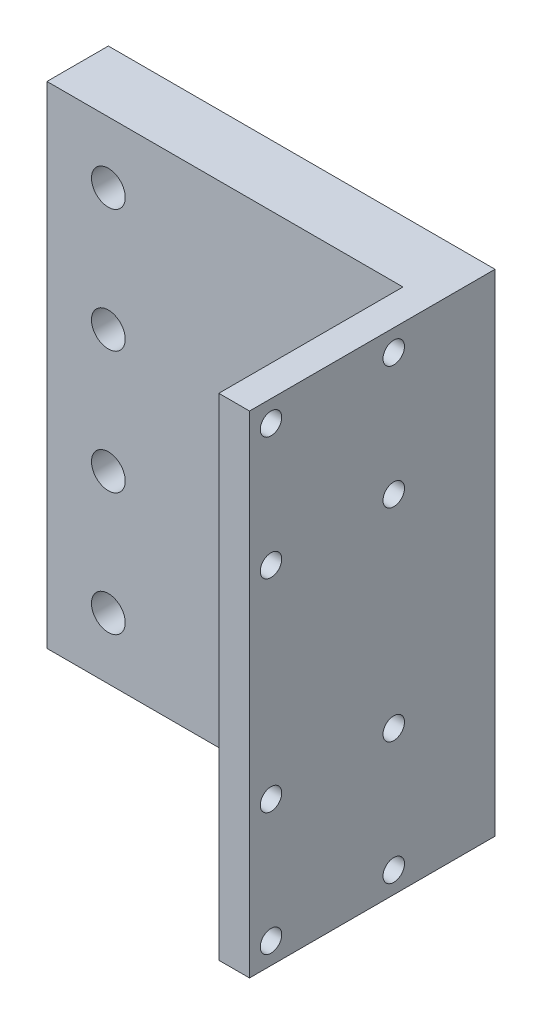
ISO-10303-21;
HEADER;
FILE_DESCRIPTION(('STEP AP214'),'2;1');
FILE_NAME('part.step','',(''),(''),'','','');
FILE_SCHEMA(('AUTOMOTIVE_DESIGN { 1 0 10303 214 1 1 1 1 }'));
ENDSEC;
DATA;
#1=APPLICATION_CONTEXT('core data for automotive mechanical design processes');
#2=APPLICATION_PROTOCOL_DEFINITION('international standard','automotive_design',2000,#1);
#3=PRODUCT_CONTEXT('',#1,'mechanical');
#4=PRODUCT('Part','Part','',(#3));
#5=PRODUCT_RELATED_PRODUCT_CATEGORY('part','',(#4));
#6=PRODUCT_DEFINITION_FORMATION('','',#4);
#7=PRODUCT_DEFINITION_CONTEXT('part definition',#1,'design');
#8=PRODUCT_DEFINITION('design','',#6,#7);
#9=PRODUCT_DEFINITION_SHAPE('','',#8);
#10=(LENGTH_UNIT() NAMED_UNIT(*) SI_UNIT(.MILLI.,.METRE.));
#11=(NAMED_UNIT(*) PLANE_ANGLE_UNIT() SI_UNIT($,.RADIAN.));
#12=(NAMED_UNIT(*) SI_UNIT($,.STERADIAN.) SOLID_ANGLE_UNIT());
#13=UNCERTAINTY_MEASURE_WITH_UNIT(LENGTH_MEASURE(1.E-05),#10,'distance_accuracy_value','');
#14=(GEOMETRIC_REPRESENTATION_CONTEXT(3) GLOBAL_UNCERTAINTY_ASSIGNED_CONTEXT((#13)) GLOBAL_UNIT_ASSIGNED_CONTEXT((#10,
#11,#12)) REPRESENTATION_CONTEXT('',''));
#15=CARTESIAN_POINT('',(0.,0.,0.));
#16=DIRECTION('',(0.,0.,1.));
#17=DIRECTION('',(1.,0.,0.));
#18=AXIS2_PLACEMENT_3D('',#15,#16,#17);
#19=CARTESIAN_POINT('',(-23.3968723584108,14.3516483516484,10.));
#20=DIRECTION('',(0.,0.,-1.));
#21=DIRECTION('',(-1.,0.,0.));
#22=AXIS2_PLACEMENT_3D('',#19,#20,#21);
#23=CYLINDRICAL_SURFACE('',#22,2.75);
#24=CARTESIAN_POINT('',(-23.3968723584108,14.3516483516484,10.));
#25=DIRECTION('',(0.,0.,1.));
#26=DIRECTION('',(1.,0.,0.));
#27=AXIS2_PLACEMENT_3D('',#24,#25,#26);
#28=CIRCLE('',#27,2.75);
#29=CARTESIAN_POINT('',(-20.6468723584108,14.3516483516484,10.));
#30=VERTEX_POINT('',#29);
#31=EDGE_CURVE('E111',#30,#30,#28,.T.);
#32=ORIENTED_EDGE('',*,*,#31,.T.);
#33=EDGE_LOOP('',(#32));
#34=FACE_BOUND('',#33,.T.);
#35=CARTESIAN_POINT('',(-23.3968723584108,14.3516483516484,5.));
#36=DIRECTION('',(0.,0.,-1.));
#37=DIRECTION('',(-1.,0.,0.));
#38=AXIS2_PLACEMENT_3D('',#35,#36,#37);
#39=CIRCLE('',#38,2.75);
#40=CARTESIAN_POINT('',(-26.1468723584108,14.3516483516484,5.));
#41=VERTEX_POINT('',#40);
#42=EDGE_CURVE('E45',#41,#41,#39,.T.);
#43=ORIENTED_EDGE('',*,*,#42,.T.);
#44=EDGE_LOOP('',(#43));
#45=FACE_BOUND('',#44,.T.);
#46=ADVANCED_FACE('F41',(#34,#45),#23,.F.);
#47=CARTESIAN_POINT('',(-23.3968723584108,-5.64835164835165,10.));
#48=DIRECTION('',(0.,0.,-1.));
#49=DIRECTION('',(-1.,0.,0.));
#50=AXIS2_PLACEMENT_3D('',#47,#48,#49);
#51=CYLINDRICAL_SURFACE('',#50,2.75);
#52=CARTESIAN_POINT('',(-23.3968723584108,-5.64835164835165,10.));
#53=DIRECTION('',(0.,0.,1.));
#54=DIRECTION('',(1.,0.,0.));
#55=AXIS2_PLACEMENT_3D('',#52,#53,#54);
#56=CIRCLE('',#55,2.75);
#57=CARTESIAN_POINT('',(-20.6468723584108,-5.64835164835165,10.));
#58=VERTEX_POINT('',#57);
#59=EDGE_CURVE('E117',#58,#58,#56,.T.);
#60=ORIENTED_EDGE('',*,*,#59,.T.);
#61=EDGE_LOOP('',(#60));
#62=FACE_BOUND('',#61,.T.);
#63=CARTESIAN_POINT('',(-23.3968723584108,-5.64835164835165,5.));
#64=DIRECTION('',(0.,0.,-1.));
#65=DIRECTION('',(-1.,0.,0.));
#66=AXIS2_PLACEMENT_3D('',#63,#64,#65);
#67=CIRCLE('',#66,2.75);
#68=CARTESIAN_POINT('',(-26.1468723584108,-5.64835164835165,5.));
#69=VERTEX_POINT('',#68);
#70=EDGE_CURVE('E137',#69,#69,#67,.T.);
#71=ORIENTED_EDGE('',*,*,#70,.T.);
#72=EDGE_LOOP('',(#71));
#73=FACE_BOUND('',#72,.T.);
#74=ADVANCED_FACE('F266',(#62,#73),#51,.F.);
#75=CARTESIAN_POINT('',(-23.3968723584108,-25.6483516483516,10.));
#76=DIRECTION('',(0.,0.,-1.));
#77=DIRECTION('',(-1.,0.,0.));
#78=AXIS2_PLACEMENT_3D('',#75,#76,#77);
#79=CYLINDRICAL_SURFACE('',#78,2.75);
#80=CARTESIAN_POINT('',(-23.3968723584108,-25.6483516483516,10.));
#81=DIRECTION('',(0.,0.,1.));
#82=DIRECTION('',(1.,0.,0.));
#83=AXIS2_PLACEMENT_3D('',#80,#81,#82);
#84=CIRCLE('',#83,2.75);
#85=CARTESIAN_POINT('',(-20.6468723584108,-25.6483516483516,10.));
#86=VERTEX_POINT('',#85);
#87=EDGE_CURVE('E227',#86,#86,#84,.T.);
#88=ORIENTED_EDGE('',*,*,#87,.T.);
#89=EDGE_LOOP('',(#88));
#90=FACE_BOUND('',#89,.T.);
#91=CARTESIAN_POINT('',(-23.3968723584108,-25.6483516483516,5.));
#92=DIRECTION('',(0.,0.,-1.));
#93=DIRECTION('',(-1.,0.,0.));
#94=AXIS2_PLACEMENT_3D('',#91,#92,#93);
#95=CIRCLE('',#94,2.75);
#96=CARTESIAN_POINT('',(-26.1468723584108,-25.6483516483516,5.));
#97=VERTEX_POINT('',#96);
#98=EDGE_CURVE('E133',#97,#97,#95,.T.);
#99=ORIENTED_EDGE('',*,*,#98,.T.);
#100=EDGE_LOOP('',(#99));
#101=FACE_BOUND('',#100,.T.);
#102=ADVANCED_FACE('F272',(#90,#101),#79,.F.);
#103=CARTESIAN_POINT('',(-23.3968723584108,-45.6483516483516,10.));
#104=DIRECTION('',(0.,0.,-1.));
#105=DIRECTION('',(-1.,0.,0.));
#106=AXIS2_PLACEMENT_3D('',#103,#104,#105);
#107=CYLINDRICAL_SURFACE('',#106,2.75);
#108=CARTESIAN_POINT('',(-23.3968723584108,-45.6483516483516,10.));
#109=DIRECTION('',(0.,0.,1.));
#110=DIRECTION('',(1.,0.,0.));
#111=AXIS2_PLACEMENT_3D('',#108,#109,#110);
#112=CIRCLE('',#111,2.75);
#113=CARTESIAN_POINT('',(-20.6468723584108,-45.6483516483516,10.));
#114=VERTEX_POINT('',#113);
#115=EDGE_CURVE('E220',#114,#114,#112,.T.);
#116=ORIENTED_EDGE('',*,*,#115,.T.);
#117=EDGE_LOOP('',(#116));
#118=FACE_BOUND('',#117,.T.);
#119=CARTESIAN_POINT('',(-23.3968723584108,-45.6483516483516,5.));
#120=DIRECTION('',(0.,0.,-1.));
#121=DIRECTION('',(-1.,0.,0.));
#122=AXIS2_PLACEMENT_3D('',#119,#120,#121);
#123=CIRCLE('',#122,2.75);
#124=CARTESIAN_POINT('',(-26.1468723584108,-45.6483516483516,5.));
#125=VERTEX_POINT('',#124);
#126=EDGE_CURVE('E129',#125,#125,#123,.T.);
#127=ORIENTED_EDGE('',*,*,#126,.T.);
#128=EDGE_LOOP('',(#127));
#129=FACE_BOUND('',#128,.T.);
#130=ADVANCED_FACE('F279',(#118,#129),#107,.F.);
#131=CARTESIAN_POINT('',(0.,0.,10.));
#132=DIRECTION('',(0.,0.,1.));
#133=DIRECTION('',(1.,0.,0.));
#134=AXIS2_PLACEMENT_3D('',#131,#132,#133);
#135=PLANE('',#134);
#136=ORIENTED_EDGE('',*,*,#87,.F.);
#137=EDGE_LOOP('',(#136));
#138=FACE_BOUND('',#137,.T.);
#139=ORIENTED_EDGE('',*,*,#31,.F.);
#140=EDGE_LOOP('',(#139));
#141=FACE_BOUND('',#140,.T.);
#142=ORIENTED_EDGE('',*,*,#59,.F.);
#143=EDGE_LOOP('',(#142));
#144=FACE_BOUND('',#143,.T.);
#145=ORIENTED_EDGE('',*,*,#115,.F.);
#146=EDGE_LOOP('',(#145));
#147=FACE_BOUND('',#146,.T.);
#148=DIRECTION('',(1.,0.,0.));
#149=VECTOR('',#148,1.);
#150=CARTESIAN_POINT('',(-33.3968723584108,-55.6483516483516,10.));
#151=LINE('',#150,#149);
#152=CARTESIAN_POINT('',(-33.3968723584108,-55.6483516483516,10.));
#153=VERTEX_POINT('',#152);
#154=CARTESIAN_POINT('',(24.6031276415892,-55.6483516483516,10.));
#155=VERTEX_POINT('',#154);
#156=EDGE_CURVE('E235',#153,#155,#151,.T.);
#157=ORIENTED_EDGE('',*,*,#156,.T.);
#158=DIRECTION('',(0.,1.,0.));
#159=VECTOR('',#158,1.);
#160=CARTESIAN_POINT('',(24.6031276415892,-55.6483516483516,10.));
#161=LINE('',#160,#159);
#162=CARTESIAN_POINT('',(24.6031276415892,24.3516483516484,10.));
#163=VERTEX_POINT('',#162);
#164=EDGE_CURVE('E197',#155,#163,#161,.T.);
#165=ORIENTED_EDGE('',*,*,#164,.T.);
#166=DIRECTION('',(-1.,0.,0.));
#167=VECTOR('',#166,1.);
#168=CARTESIAN_POINT('',(-33.3968723584108,24.3516483516484,10.));
#169=LINE('',#168,#167);
#170=CARTESIAN_POINT('',(-33.3968723584108,24.3516483516484,10.));
#171=VERTEX_POINT('',#170);
#172=EDGE_CURVE('E67',#163,#171,#169,.T.);
#173=ORIENTED_EDGE('',*,*,#172,.T.);
#174=DIRECTION('',(0.,-1.,0.));
#175=VECTOR('',#174,1.);
#176=CARTESIAN_POINT('',(-33.3968723584108,24.3516483516484,10.));
#177=LINE('',#176,#175);
#178=EDGE_CURVE('E99',#171,#153,#177,.T.);
#179=ORIENTED_EDGE('',*,*,#178,.T.);
#180=EDGE_LOOP('',(#157,#165,#173,#179));
#181=FACE_BOUND('',#180,.T.);
#182=ADVANCED_FACE('F240',(#138,#141,#144,#147,#181),#135,.T.);
#183=CARTESIAN_POINT('',(0.,0.,0.));
#184=DIRECTION('',(0.,0.,1.));
#185=DIRECTION('',(1.,0.,0.));
#186=AXIS2_PLACEMENT_3D('',#183,#184,#185);
#187=PLANE('',#186);
#188=CARTESIAN_POINT('',(-23.3968723584108,-45.6483516483516,0.));
#189=DIRECTION('',(0.,0.,-1.));
#190=DIRECTION('',(-1.,0.,0.));
#191=AXIS2_PLACEMENT_3D('',#188,#189,#190);
#192=CIRCLE('',#191,6.);
#193=CARTESIAN_POINT('',(-29.3968723584108,-45.6483516483516,0.));
#194=VERTEX_POINT('',#193);
#195=EDGE_CURVE('E487',#194,#194,#192,.T.);
#196=ORIENTED_EDGE('',*,*,#195,.F.);
#197=EDGE_LOOP('',(#196));
#198=FACE_BOUND('',#197,.T.);
#199=CARTESIAN_POINT('',(-23.3968723584108,-25.6483516483516,0.));
#200=DIRECTION('',(0.,0.,-1.));
#201=DIRECTION('',(-1.,0.,0.));
#202=AXIS2_PLACEMENT_3D('',#199,#200,#201);
#203=CIRCLE('',#202,6.);
#204=CARTESIAN_POINT('',(-29.3968723584108,-25.6483516483516,0.));
#205=VERTEX_POINT('',#204);
#206=EDGE_CURVE('E497',#205,#205,#203,.T.);
#207=ORIENTED_EDGE('',*,*,#206,.F.);
#208=EDGE_LOOP('',(#207));
#209=FACE_BOUND('',#208,.T.);
#210=CARTESIAN_POINT('',(-23.3968723584108,-5.64835164835165,0.));
#211=DIRECTION('',(0.,0.,-1.));
#212=DIRECTION('',(-1.,0.,0.));
#213=AXIS2_PLACEMENT_3D('',#210,#211,#212);
#214=CIRCLE('',#213,6.);
#215=CARTESIAN_POINT('',(-29.3968723584108,-5.64835164835165,0.));
#216=VERTEX_POINT('',#215);
#217=EDGE_CURVE('E505',#216,#216,#214,.T.);
#218=ORIENTED_EDGE('',*,*,#217,.F.);
#219=EDGE_LOOP('',(#218));
#220=FACE_BOUND('',#219,.T.);
#221=CARTESIAN_POINT('',(-23.3968723584108,14.3516483516484,0.));
#222=DIRECTION('',(0.,0.,-1.));
#223=DIRECTION('',(-1.,0.,0.));
#224=AXIS2_PLACEMENT_3D('',#221,#222,#223);
#225=CIRCLE('',#224,6.);
#226=CARTESIAN_POINT('',(-29.3968723584108,14.3516483516484,0.));
#227=VERTEX_POINT('',#226);
#228=EDGE_CURVE('E513',#227,#227,#225,.T.);
#229=ORIENTED_EDGE('',*,*,#228,.F.);
#230=EDGE_LOOP('',(#229));
#231=FACE_BOUND('',#230,.T.);
#232=DIRECTION('',(0.,-1.,0.));
#233=VECTOR('',#232,1.);
#234=CARTESIAN_POINT('',(-33.3968723584108,24.3516483516484,0.));
#235=LINE('',#234,#233);
#236=CARTESIAN_POINT('',(-33.3968723584108,24.3516483516484,0.));
#237=VERTEX_POINT('',#236);
#238=CARTESIAN_POINT('',(-33.3968723584108,-55.6483516483516,0.));
#239=VERTEX_POINT('',#238);
#240=EDGE_CURVE('E105',#237,#239,#235,.T.);
#241=ORIENTED_EDGE('',*,*,#240,.F.);
#242=DIRECTION('',(-1.,0.,0.));
#243=VECTOR('',#242,1.);
#244=CARTESIAN_POINT('',(-33.3968723584108,24.3516483516484,0.));
#245=LINE('',#244,#243);
#246=CARTESIAN_POINT('',(29.6031276415892,24.3516483516484,0.));
#247=VERTEX_POINT('',#246);
#248=EDGE_CURVE('E87',#247,#237,#245,.T.);
#249=ORIENTED_EDGE('',*,*,#248,.F.);
#250=DIRECTION('',(0.,1.,0.));
#251=VECTOR('',#250,1.);
#252=CARTESIAN_POINT('',(29.6031276415892,24.3516483516484,0.));
#253=LINE('',#252,#251);
#254=CARTESIAN_POINT('',(29.6031276415892,-55.6483516483516,0.));
#255=VERTEX_POINT('',#254);
#256=EDGE_CURVE('E100',#255,#247,#253,.T.);
#257=ORIENTED_EDGE('',*,*,#256,.F.);
#258=DIRECTION('',(1.,0.,0.));
#259=VECTOR('',#258,1.);
#260=CARTESIAN_POINT('',(-33.3968723584108,-55.6483516483516,0.));
#261=LINE('',#260,#259);
#262=EDGE_CURVE('E109',#239,#255,#261,.T.);
#263=ORIENTED_EDGE('',*,*,#262,.F.);
#264=EDGE_LOOP('',(#241,#249,#257,#263));
#265=FACE_BOUND('',#264,.T.);
#266=ADVANCED_FACE('F108',(#198,#209,#220,#231,#265),#187,.F.);
#267=CARTESIAN_POINT('',(-33.3968723584108,24.3516483516484,10.));
#268=DIRECTION('',(1.,0.,0.));
#269=DIRECTION('',(0.,0.,-1.));
#270=AXIS2_PLACEMENT_3D('',#267,#268,#269);
#271=PLANE('',#270);
#272=ORIENTED_EDGE('',*,*,#240,.T.);
#273=DIRECTION('',(0.,0.,-1.));
#274=VECTOR('',#273,1.);
#275=CARTESIAN_POINT('',(-33.3968723584108,-55.6483516483516,10.));
#276=LINE('',#275,#274);
#277=EDGE_CURVE('E11',#153,#239,#276,.T.);
#278=ORIENTED_EDGE('',*,*,#277,.F.);
#279=ORIENTED_EDGE('',*,*,#178,.F.);
#280=DIRECTION('',(0.,0.,-1.));
#281=VECTOR('',#280,1.);
#282=CARTESIAN_POINT('',(-33.3968723584108,24.3516483516484,10.));
#283=LINE('',#282,#281);
#284=EDGE_CURVE('E90',#171,#237,#283,.T.);
#285=ORIENTED_EDGE('',*,*,#284,.T.);
#286=EDGE_LOOP('',(#272,#278,#279,#285));
#287=FACE_BOUND('',#286,.T.);
#288=ADVANCED_FACE('F43',(#287),#271,.F.);
#289=CARTESIAN_POINT('',(-33.3968723584108,-55.6483516483516,10.));
#290=DIRECTION('',(0.,1.,0.));
#291=DIRECTION('',(0.,0.,1.));
#292=AXIS2_PLACEMENT_3D('',#289,#290,#291);
#293=PLANE('',#292);
#294=ORIENTED_EDGE('',*,*,#262,.T.);
#295=DIRECTION('',(0.,0.,-1.));
#296=VECTOR('',#295,1.);
#297=CARTESIAN_POINT('',(29.6031276415892,-55.6483516483516,10.));
#298=LINE('',#297,#296);
#299=CARTESIAN_POINT('',(29.6031276415892,-55.6483516483516,40.));
#300=VERTEX_POINT('',#299);
#301=EDGE_CURVE('E51',#300,#255,#298,.T.);
#302=ORIENTED_EDGE('',*,*,#301,.F.);
#303=DIRECTION('',(-1.,0.,0.));
#304=VECTOR('',#303,1.);
#305=CARTESIAN_POINT('',(29.6031276415892,-55.6483516483516,40.));
#306=LINE('',#305,#304);
#307=CARTESIAN_POINT('',(24.6031276415892,-55.6483516483516,40.));
#308=VERTEX_POINT('',#307);
#309=EDGE_CURVE('E205',#300,#308,#306,.T.);
#310=ORIENTED_EDGE('',*,*,#309,.T.);
#311=DIRECTION('',(0.,0.,-1.));
#312=VECTOR('',#311,1.);
#313=CARTESIAN_POINT('',(24.6031276415892,-55.6483516483516,40.));
#314=LINE('',#313,#312);
#315=EDGE_CURVE('E215',#308,#155,#314,.T.);
#316=ORIENTED_EDGE('',*,*,#315,.T.);
#317=ORIENTED_EDGE('',*,*,#156,.F.);
#318=ORIENTED_EDGE('',*,*,#277,.T.);
#319=EDGE_LOOP('',(#294,#302,#310,#316,#317,#318));
#320=FACE_BOUND('',#319,.T.);
#321=ADVANCED_FACE('F243',(#320),#293,.F.);
#322=CARTESIAN_POINT('',(29.6031276415892,24.3516483516484,10.));
#323=DIRECTION('',(-1.,0.,0.));
#324=DIRECTION('',(0.,-1.,0.));
#325=AXIS2_PLACEMENT_3D('',#322,#323,#324);
#326=PLANE('',#325);
#327=CARTESIAN_POINT('',(29.6031276415892,0.851648351648357,36.5));
#328=DIRECTION('',(1.,0.,0.));
#329=DIRECTION('',(0.,1.,0.));
#330=AXIS2_PLACEMENT_3D('',#327,#328,#329);
#331=CIRCLE('',#330,1.75);
#332=CARTESIAN_POINT('',(29.6031276415892,2.60164835164836,36.5));
#333=VERTEX_POINT('',#332);
#334=EDGE_CURVE('E168',#333,#333,#331,.T.);
#335=ORIENTED_EDGE('',*,*,#334,.F.);
#336=EDGE_LOOP('',(#335));
#337=FACE_BOUND('',#336,.T.);
#338=CARTESIAN_POINT('',(29.6031276415892,-52.1483516483516,16.5));
#339=DIRECTION('',(1.,0.,0.));
#340=DIRECTION('',(0.,1.,0.));
#341=AXIS2_PLACEMENT_3D('',#338,#339,#340);
#342=CIRCLE('',#341,1.75);
#343=CARTESIAN_POINT('',(29.6031276415892,-50.3983516483516,16.5));
#344=VERTEX_POINT('',#343);
#345=EDGE_CURVE('E159',#344,#344,#342,.T.);
#346=ORIENTED_EDGE('',*,*,#345,.F.);
#347=EDGE_LOOP('',(#346));
#348=FACE_BOUND('',#347,.T.);
#349=CARTESIAN_POINT('',(29.6031276415892,-32.1483516483516,16.5));
#350=DIRECTION('',(1.,0.,0.));
#351=DIRECTION('',(0.,1.,0.));
#352=AXIS2_PLACEMENT_3D('',#349,#350,#351);
#353=CIRCLE('',#352,1.75);
#354=CARTESIAN_POINT('',(29.6031276415892,-30.3983516483516,16.5));
#355=VERTEX_POINT('',#354);
#356=EDGE_CURVE('E186',#355,#355,#353,.T.);
#357=ORIENTED_EDGE('',*,*,#356,.F.);
#358=EDGE_LOOP('',(#357));
#359=FACE_BOUND('',#358,.T.);
#360=CARTESIAN_POINT('',(29.6031276415892,-32.1483516483516,36.5));
#361=DIRECTION('',(1.,0.,0.));
#362=DIRECTION('',(0.,1.,0.));
#363=AXIS2_PLACEMENT_3D('',#360,#361,#362);
#364=CIRCLE('',#363,1.75);
#365=CARTESIAN_POINT('',(29.6031276415892,-30.3983516483516,36.5));
#366=VERTEX_POINT('',#365);
#367=EDGE_CURVE('E177',#366,#366,#364,.T.);
#368=ORIENTED_EDGE('',*,*,#367,.F.);
#369=EDGE_LOOP('',(#368));
#370=FACE_BOUND('',#369,.T.);
#371=CARTESIAN_POINT('',(29.6031276415892,20.8516483516484,36.5));
#372=DIRECTION('',(1.,0.,0.));
#373=DIRECTION('',(0.,1.,0.));
#374=AXIS2_PLACEMENT_3D('',#371,#372,#373);
#375=CIRCLE('',#374,1.75);
#376=CARTESIAN_POINT('',(29.6031276415892,22.6016483516484,36.5));
#377=VERTEX_POINT('',#376);
#378=EDGE_CURVE('E176',#377,#377,#375,.T.);
#379=ORIENTED_EDGE('',*,*,#378,.F.);
#380=EDGE_LOOP('',(#379));
#381=FACE_BOUND('',#380,.T.);
#382=CARTESIAN_POINT('',(29.6031276415892,20.8516483516484,16.5));
#383=DIRECTION('',(1.,0.,0.));
#384=DIRECTION('',(0.,1.,0.));
#385=AXIS2_PLACEMENT_3D('',#382,#383,#384);
#386=CIRCLE('',#385,1.75);
#387=CARTESIAN_POINT('',(29.6031276415892,22.6016483516484,16.5));
#388=VERTEX_POINT('',#387);
#389=EDGE_CURVE('E524',#388,#388,#386,.T.);
#390=ORIENTED_EDGE('',*,*,#389,.F.);
#391=EDGE_LOOP('',(#390));
#392=FACE_BOUND('',#391,.T.);
#393=CARTESIAN_POINT('',(29.6031276415892,0.851648351648357,16.5));
#394=DIRECTION('',(1.,0.,0.));
#395=DIRECTION('',(0.,1.,0.));
#396=AXIS2_PLACEMENT_3D('',#393,#394,#395);
#397=CIRCLE('',#396,1.75);
#398=CARTESIAN_POINT('',(29.6031276415892,2.60164835164836,16.5));
#399=VERTEX_POINT('',#398);
#400=EDGE_CURVE('E149',#399,#399,#397,.T.);
#401=ORIENTED_EDGE('',*,*,#400,.F.);
#402=EDGE_LOOP('',(#401));
#403=FACE_BOUND('',#402,.T.);
#404=CARTESIAN_POINT('',(29.6031276415892,-52.1483516483516,36.5));
#405=DIRECTION('',(1.,0.,0.));
#406=DIRECTION('',(0.,1.,0.));
#407=AXIS2_PLACEMENT_3D('',#404,#405,#406);
#408=CIRCLE('',#407,1.75);
#409=CARTESIAN_POINT('',(29.6031276415892,-50.3983516483516,36.5));
#410=VERTEX_POINT('',#409);
#411=EDGE_CURVE('E193',#410,#410,#408,.T.);
#412=ORIENTED_EDGE('',*,*,#411,.F.);
#413=EDGE_LOOP('',(#412));
#414=FACE_BOUND('',#413,.T.);
#415=ORIENTED_EDGE('',*,*,#256,.T.);
#416=DIRECTION('',(0.,0.,-1.));
#417=VECTOR('',#416,1.);
#418=CARTESIAN_POINT('',(29.6031276415892,24.3516483516484,10.));
#419=LINE('',#418,#417);
#420=CARTESIAN_POINT('',(29.6031276415892,24.3516483516484,40.));
#421=VERTEX_POINT('',#420);
#422=EDGE_CURVE('E94',#421,#247,#419,.T.);
#423=ORIENTED_EDGE('',*,*,#422,.F.);
#424=DIRECTION('',(0.,-1.,0.));
#425=VECTOR('',#424,1.);
#426=CARTESIAN_POINT('',(29.6031276415892,-55.6483516483516,40.));
#427=LINE('',#426,#425);
#428=EDGE_CURVE('E201',#421,#300,#427,.T.);
#429=ORIENTED_EDGE('',*,*,#428,.T.);
#430=ORIENTED_EDGE('',*,*,#301,.T.);
#431=EDGE_LOOP('',(#415,#423,#429,#430));
#432=FACE_BOUND('',#431,.T.);
#433=ADVANCED_FACE('F261',(#337,#348,#359,#370,#381,#392,#403,#414,#432),#326,.F.);
#434=CARTESIAN_POINT('',(-33.3968723584108,24.3516483516484,10.));
#435=DIRECTION('',(0.,-1.,0.));
#436=DIRECTION('',(0.,0.,-1.));
#437=AXIS2_PLACEMENT_3D('',#434,#435,#436);
#438=PLANE('',#437);
#439=ORIENTED_EDGE('',*,*,#248,.T.);
#440=ORIENTED_EDGE('',*,*,#284,.F.);
#441=ORIENTED_EDGE('',*,*,#172,.F.);
#442=DIRECTION('',(0.,0.,-1.));
#443=VECTOR('',#442,1.);
#444=CARTESIAN_POINT('',(24.6031276415892,24.3516483516484,40.));
#445=LINE('',#444,#443);
#446=CARTESIAN_POINT('',(24.6031276415892,24.3516483516484,40.));
#447=VERTEX_POINT('',#446);
#448=EDGE_CURVE('E59',#447,#163,#445,.T.);
#449=ORIENTED_EDGE('',*,*,#448,.F.);
#450=DIRECTION('',(1.,0.,0.));
#451=VECTOR('',#450,1.);
#452=CARTESIAN_POINT('',(29.6031276415892,24.3516483516484,40.));
#453=LINE('',#452,#451);
#454=EDGE_CURVE('E212',#447,#421,#453,.T.);
#455=ORIENTED_EDGE('',*,*,#454,.T.);
#456=ORIENTED_EDGE('',*,*,#422,.T.);
#457=EDGE_LOOP('',(#439,#440,#441,#449,#455,#456));
#458=FACE_BOUND('',#457,.T.);
#459=ADVANCED_FACE('F89',(#458),#438,.F.);
#460=CARTESIAN_POINT('',(24.6031276415892,-55.6483516483516,40.));
#461=DIRECTION('',(-1.,0.,0.));
#462=DIRECTION('',(0.,0.,1.));
#463=AXIS2_PLACEMENT_3D('',#460,#461,#462);
#464=PLANE('',#463);
#465=CARTESIAN_POINT('',(24.6031276415892,0.851648351648356,36.5));
#466=DIRECTION('',(-1.,0.,0.));
#467=DIRECTION('',(0.,0.,1.));
#468=AXIS2_PLACEMENT_3D('',#465,#466,#467);
#469=CIRCLE('',#468,1.75);
#470=CARTESIAN_POINT('',(24.6031276415892,0.851648351648356,38.25));
#471=VERTEX_POINT('',#470);
#472=EDGE_CURVE('E172',#471,#471,#469,.F.);
#473=ORIENTED_EDGE('',*,*,#472,.T.);
#474=EDGE_LOOP('',(#473));
#475=FACE_BOUND('',#474,.T.);
#476=CARTESIAN_POINT('',(24.6031276415892,-52.1483516483516,16.5));
#477=DIRECTION('',(-1.,0.,0.));
#478=DIRECTION('',(0.,0.,1.));
#479=AXIS2_PLACEMENT_3D('',#476,#477,#478);
#480=CIRCLE('',#479,1.75);
#481=CARTESIAN_POINT('',(24.6031276415892,-52.1483516483516,18.25));
#482=VERTEX_POINT('',#481);
#483=EDGE_CURVE('E164',#482,#482,#480,.F.);
#484=ORIENTED_EDGE('',*,*,#483,.T.);
#485=EDGE_LOOP('',(#484));
#486=FACE_BOUND('',#485,.T.);
#487=CARTESIAN_POINT('',(24.6031276415892,-32.1483516483516,16.5));
#488=DIRECTION('',(-1.,0.,0.));
#489=DIRECTION('',(0.,0.,1.));
#490=AXIS2_PLACEMENT_3D('',#487,#488,#489);
#491=CIRCLE('',#490,1.75);
#492=CARTESIAN_POINT('',(24.6031276415892,-32.1483516483516,18.25));
#493=VERTEX_POINT('',#492);
#494=EDGE_CURVE('E163',#493,#493,#491,.F.);
#495=ORIENTED_EDGE('',*,*,#494,.T.);
#496=EDGE_LOOP('',(#495));
#497=FACE_BOUND('',#496,.T.);
#498=CARTESIAN_POINT('',(24.6031276415892,-32.1483516483516,36.5));
#499=DIRECTION('',(-1.,0.,0.));
#500=DIRECTION('',(0.,0.,1.));
#501=AXIS2_PLACEMENT_3D('',#498,#499,#500);
#502=CIRCLE('',#501,1.75);
#503=CARTESIAN_POINT('',(24.6031276415892,-32.1483516483516,38.25));
#504=VERTEX_POINT('',#503);
#505=EDGE_CURVE('E182',#504,#504,#502,.F.);
#506=ORIENTED_EDGE('',*,*,#505,.T.);
#507=EDGE_LOOP('',(#506));
#508=FACE_BOUND('',#507,.T.);
#509=CARTESIAN_POINT('',(24.6031276415892,20.8516483516484,36.5));
#510=DIRECTION('',(-1.,0.,0.));
#511=DIRECTION('',(0.,0.,1.));
#512=AXIS2_PLACEMENT_3D('',#509,#510,#511);
#513=CIRCLE('',#512,1.75);
#514=CARTESIAN_POINT('',(24.6031276415892,20.8516483516484,38.25));
#515=VERTEX_POINT('',#514);
#516=EDGE_CURVE('E520',#515,#515,#513,.F.);
#517=ORIENTED_EDGE('',*,*,#516,.T.);
#518=EDGE_LOOP('',(#517));
#519=FACE_BOUND('',#518,.T.);
#520=CARTESIAN_POINT('',(24.6031276415892,20.8516483516484,16.5));
#521=DIRECTION('',(-1.,0.,0.));
#522=DIRECTION('',(0.,0.,1.));
#523=AXIS2_PLACEMENT_3D('',#520,#521,#522);
#524=CIRCLE('',#523,1.75);
#525=CARTESIAN_POINT('',(24.6031276415892,20.8516483516484,18.25));
#526=VERTEX_POINT('',#525);
#527=EDGE_CURVE('E155',#526,#526,#524,.F.);
#528=ORIENTED_EDGE('',*,*,#527,.T.);
#529=EDGE_LOOP('',(#528));
#530=FACE_BOUND('',#529,.T.);
#531=CARTESIAN_POINT('',(24.6031276415892,0.851648351648356,16.5));
#532=DIRECTION('',(-1.,0.,0.));
#533=DIRECTION('',(0.,0.,1.));
#534=AXIS2_PLACEMENT_3D('',#531,#532,#533);
#535=CIRCLE('',#534,1.75);
#536=CARTESIAN_POINT('',(24.6031276415892,0.851648351648356,18.25));
#537=VERTEX_POINT('',#536);
#538=EDGE_CURVE('E144',#537,#537,#535,.F.);
#539=ORIENTED_EDGE('',*,*,#538,.T.);
#540=EDGE_LOOP('',(#539));
#541=FACE_BOUND('',#540,.T.);
#542=CARTESIAN_POINT('',(24.6031276415892,-52.1483516483516,36.5));
#543=DIRECTION('',(-1.,0.,0.));
#544=DIRECTION('',(0.,0.,1.));
#545=AXIS2_PLACEMENT_3D('',#542,#543,#544);
#546=CIRCLE('',#545,1.75);
#547=CARTESIAN_POINT('',(24.6031276415892,-52.1483516483516,38.25));
#548=VERTEX_POINT('',#547);
#549=EDGE_CURVE('E181',#548,#548,#546,.F.);
#550=ORIENTED_EDGE('',*,*,#549,.T.);
#551=EDGE_LOOP('',(#550));
#552=FACE_BOUND('',#551,.T.);
#553=ORIENTED_EDGE('',*,*,#164,.F.);
#554=ORIENTED_EDGE('',*,*,#315,.F.);
#555=DIRECTION('',(0.,1.,0.));
#556=VECTOR('',#555,1.);
#557=CARTESIAN_POINT('',(24.6031276415892,-55.6483516483516,40.));
#558=LINE('',#557,#556);
#559=EDGE_CURVE('E209',#308,#447,#558,.T.);
#560=ORIENTED_EDGE('',*,*,#559,.T.);
#561=ORIENTED_EDGE('',*,*,#448,.T.);
#562=EDGE_LOOP('',(#553,#554,#560,#561));
#563=FACE_BOUND('',#562,.T.);
#564=ADVANCED_FACE('F249',(#475,#486,#497,#508,#519,#530,#541,#552,#563),#464,.T.);
#565=CARTESIAN_POINT('',(0.,0.,40.));
#566=DIRECTION('',(0.,0.,1.));
#567=DIRECTION('',(1.,0.,0.));
#568=AXIS2_PLACEMENT_3D('',#565,#566,#567);
#569=PLANE('',#568);
#570=ORIENTED_EDGE('',*,*,#428,.F.);
#571=ORIENTED_EDGE('',*,*,#454,.F.);
#572=ORIENTED_EDGE('',*,*,#559,.F.);
#573=ORIENTED_EDGE('',*,*,#309,.F.);
#574=EDGE_LOOP('',(#570,#571,#572,#573));
#575=FACE_BOUND('',#574,.T.);
#576=ADVANCED_FACE('F251',(#575),#569,.T.);
#577=CARTESIAN_POINT('',(-33.3978723584108,-52.1483516483516,36.5));
#578=DIRECTION('',(1.,0.,0.));
#579=DIRECTION('',(0.,1.,0.));
#580=AXIS2_PLACEMENT_3D('',#577,#578,#579);
#581=CYLINDRICAL_SURFACE('',#580,1.75);
#582=ORIENTED_EDGE('',*,*,#549,.F.);
#583=EDGE_LOOP('',(#582));
#584=FACE_BOUND('',#583,.T.);
#585=ORIENTED_EDGE('',*,*,#411,.T.);
#586=EDGE_LOOP('',(#585));
#587=FACE_BOUND('',#586,.T.);
#588=ADVANCED_FACE('F258',(#584,#587),#581,.F.);
#589=CARTESIAN_POINT('',(-33.3978723584108,0.851648351648348,16.5));
#590=DIRECTION('',(1.,0.,0.));
#591=DIRECTION('',(0.,1.,0.));
#592=AXIS2_PLACEMENT_3D('',#589,#590,#591);
#593=CYLINDRICAL_SURFACE('',#592,1.75);
#594=ORIENTED_EDGE('',*,*,#538,.F.);
#595=EDGE_LOOP('',(#594));
#596=FACE_BOUND('',#595,.T.);
#597=ORIENTED_EDGE('',*,*,#400,.T.);
#598=EDGE_LOOP('',(#597));
#599=FACE_BOUND('',#598,.T.);
#600=ADVANCED_FACE('F384',(#596,#599),#593,.F.);
#601=CARTESIAN_POINT('',(-33.3978723584108,20.8516483516483,16.5));
#602=DIRECTION('',(1.,0.,0.));
#603=DIRECTION('',(0.,1.,0.));
#604=AXIS2_PLACEMENT_3D('',#601,#602,#603);
#605=CYLINDRICAL_SURFACE('',#604,1.75);
#606=ORIENTED_EDGE('',*,*,#527,.F.);
#607=EDGE_LOOP('',(#606));
#608=FACE_BOUND('',#607,.T.);
#609=ORIENTED_EDGE('',*,*,#389,.T.);
#610=EDGE_LOOP('',(#609));
#611=FACE_BOUND('',#610,.T.);
#612=ADVANCED_FACE('F374',(#608,#611),#605,.F.);
#613=CARTESIAN_POINT('',(-33.3978723584108,20.8516483516483,36.5));
#614=DIRECTION('',(1.,0.,0.));
#615=DIRECTION('',(0.,1.,0.));
#616=AXIS2_PLACEMENT_3D('',#613,#614,#615);
#617=CYLINDRICAL_SURFACE('',#616,1.75);
#618=ORIENTED_EDGE('',*,*,#516,.F.);
#619=EDGE_LOOP('',(#618));
#620=FACE_BOUND('',#619,.T.);
#621=ORIENTED_EDGE('',*,*,#378,.T.);
#622=EDGE_LOOP('',(#621));
#623=FACE_BOUND('',#622,.T.);
#624=ADVANCED_FACE('F364',(#620,#623),#617,.F.);
#625=CARTESIAN_POINT('',(-33.3978723584108,-32.1483516483517,36.5));
#626=DIRECTION('',(1.,0.,0.));
#627=DIRECTION('',(0.,1.,0.));
#628=AXIS2_PLACEMENT_3D('',#625,#626,#627);
#629=CYLINDRICAL_SURFACE('',#628,1.75);
#630=ORIENTED_EDGE('',*,*,#505,.F.);
#631=EDGE_LOOP('',(#630));
#632=FACE_BOUND('',#631,.T.);
#633=ORIENTED_EDGE('',*,*,#367,.T.);
#634=EDGE_LOOP('',(#633));
#635=FACE_BOUND('',#634,.T.);
#636=ADVANCED_FACE('F354',(#632,#635),#629,.F.);
#637=CARTESIAN_POINT('',(-33.3978723584108,-32.1483516483517,16.5));
#638=DIRECTION('',(1.,0.,0.));
#639=DIRECTION('',(0.,1.,0.));
#640=AXIS2_PLACEMENT_3D('',#637,#638,#639);
#641=CYLINDRICAL_SURFACE('',#640,1.75);
#642=ORIENTED_EDGE('',*,*,#494,.F.);
#643=EDGE_LOOP('',(#642));
#644=FACE_BOUND('',#643,.T.);
#645=ORIENTED_EDGE('',*,*,#356,.T.);
#646=EDGE_LOOP('',(#645));
#647=FACE_BOUND('',#646,.T.);
#648=ADVANCED_FACE('F344',(#644,#647),#641,.F.);
#649=CARTESIAN_POINT('',(-33.3978723584108,-52.1483516483516,16.5));
#650=DIRECTION('',(1.,0.,0.));
#651=DIRECTION('',(0.,1.,0.));
#652=AXIS2_PLACEMENT_3D('',#649,#650,#651);
#653=CYLINDRICAL_SURFACE('',#652,1.75);
#654=ORIENTED_EDGE('',*,*,#483,.F.);
#655=EDGE_LOOP('',(#654));
#656=FACE_BOUND('',#655,.T.);
#657=ORIENTED_EDGE('',*,*,#345,.T.);
#658=EDGE_LOOP('',(#657));
#659=FACE_BOUND('',#658,.T.);
#660=ADVANCED_FACE('F333',(#656,#659),#653,.F.);
#661=CARTESIAN_POINT('',(-33.3978723584108,0.851648351648348,36.5));
#662=DIRECTION('',(1.,0.,0.));
#663=DIRECTION('',(0.,1.,0.));
#664=AXIS2_PLACEMENT_3D('',#661,#662,#663);
#665=CYLINDRICAL_SURFACE('',#664,1.75);
#666=ORIENTED_EDGE('',*,*,#472,.F.);
#667=EDGE_LOOP('',(#666));
#668=FACE_BOUND('',#667,.T.);
#669=ORIENTED_EDGE('',*,*,#334,.T.);
#670=EDGE_LOOP('',(#669));
#671=FACE_BOUND('',#670,.T.);
#672=ADVANCED_FACE('F327',(#668,#671),#665,.F.);
#673=CARTESIAN_POINT('',(-23.3968723584108,-45.6483516483516,5.));
#674=DIRECTION('',(0.,0.,-1.));
#675=DIRECTION('',(-1.,0.,0.));
#676=AXIS2_PLACEMENT_3D('',#673,#674,#675);
#677=CYLINDRICAL_SURFACE('',#676,6.);
#678=CARTESIAN_POINT('',(-23.3968723584108,-45.6483516483516,5.));
#679=DIRECTION('',(0.,0.,-1.));
#680=DIRECTION('',(-1.,0.,0.));
#681=AXIS2_PLACEMENT_3D('',#678,#679,#680);
#682=CIRCLE('',#681,6.);
#683=CARTESIAN_POINT('',(-29.3968723584108,-45.6483516483516,5.));
#684=VERTEX_POINT('',#683);
#685=EDGE_CURVE('E134',#684,#684,#682,.T.);
#686=ORIENTED_EDGE('',*,*,#685,.F.);
#687=EDGE_LOOP('',(#686));
#688=FACE_BOUND('',#687,.T.);
#689=ORIENTED_EDGE('',*,*,#195,.T.);
#690=EDGE_LOOP('',(#689));
#691=FACE_BOUND('',#690,.T.);
#692=ADVANCED_FACE('F332',(#688,#691),#677,.F.);
#693=CARTESIAN_POINT('',(-23.3968723584108,-45.6483516483516,5.));
#694=DIRECTION('',(0.,0.,-1.));
#695=DIRECTION('',(-1.,0.,0.));
#696=AXIS2_PLACEMENT_3D('',#693,#694,#695);
#697=PLANE('',#696);
#698=ORIENTED_EDGE('',*,*,#126,.F.);
#699=EDGE_LOOP('',(#698));
#700=FACE_BOUND('',#699,.T.);
#701=ORIENTED_EDGE('',*,*,#685,.T.);
#702=EDGE_LOOP('',(#701));
#703=FACE_BOUND('',#702,.T.);
#704=ADVANCED_FACE('F471',(#700,#703),#697,.T.);
#705=CARTESIAN_POINT('',(-23.3968723584108,-25.6483516483516,5.));
#706=DIRECTION('',(0.,0.,-1.));
#707=DIRECTION('',(-1.,0.,0.));
#708=AXIS2_PLACEMENT_3D('',#705,#706,#707);
#709=CYLINDRICAL_SURFACE('',#708,6.);
#710=CARTESIAN_POINT('',(-23.3968723584108,-25.6483516483516,5.));
#711=DIRECTION('',(0.,0.,-1.));
#712=DIRECTION('',(-1.,0.,0.));
#713=AXIS2_PLACEMENT_3D('',#710,#711,#712);
#714=CIRCLE('',#713,6.);
#715=CARTESIAN_POINT('',(-29.3968723584108,-25.6483516483516,5.));
#716=VERTEX_POINT('',#715);
#717=EDGE_CURVE('E491',#716,#716,#714,.T.);
#718=ORIENTED_EDGE('',*,*,#717,.F.);
#719=EDGE_LOOP('',(#718));
#720=FACE_BOUND('',#719,.T.);
#721=ORIENTED_EDGE('',*,*,#206,.T.);
#722=EDGE_LOOP('',(#721));
#723=FACE_BOUND('',#722,.T.);
#724=ADVANCED_FACE('F468',(#720,#723),#709,.F.);
#725=CARTESIAN_POINT('',(-23.3968723584108,-25.6483516483516,5.));
#726=DIRECTION('',(0.,0.,-1.));
#727=DIRECTION('',(-1.,0.,0.));
#728=AXIS2_PLACEMENT_3D('',#725,#726,#727);
#729=PLANE('',#728);
#730=ORIENTED_EDGE('',*,*,#98,.F.);
#731=EDGE_LOOP('',(#730));
#732=FACE_BOUND('',#731,.T.);
#733=ORIENTED_EDGE('',*,*,#717,.T.);
#734=EDGE_LOOP('',(#733));
#735=FACE_BOUND('',#734,.T.);
#736=ADVANCED_FACE('F463',(#732,#735),#729,.T.);
#737=CARTESIAN_POINT('',(-23.3968723584108,-5.64835164835165,5.));
#738=DIRECTION('',(0.,0.,-1.));
#739=DIRECTION('',(-1.,0.,0.));
#740=AXIS2_PLACEMENT_3D('',#737,#738,#739);
#741=CYLINDRICAL_SURFACE('',#740,6.);
#742=CARTESIAN_POINT('',(-23.3968723584108,-5.64835164835165,5.));
#743=DIRECTION('',(0.,0.,-1.));
#744=DIRECTION('',(-1.,0.,0.));
#745=AXIS2_PLACEMENT_3D('',#742,#743,#744);
#746=CIRCLE('',#745,6.);
#747=CARTESIAN_POINT('',(-29.3968723584108,-5.64835164835165,5.));
#748=VERTEX_POINT('',#747);
#749=EDGE_CURVE('E501',#748,#748,#746,.T.);
#750=ORIENTED_EDGE('',*,*,#749,.F.);
#751=EDGE_LOOP('',(#750));
#752=FACE_BOUND('',#751,.T.);
#753=ORIENTED_EDGE('',*,*,#217,.T.);
#754=EDGE_LOOP('',(#753));
#755=FACE_BOUND('',#754,.T.);
#756=ADVANCED_FACE('F460',(#752,#755),#741,.F.);
#757=CARTESIAN_POINT('',(-23.3968723584108,-5.64835164835165,5.));
#758=DIRECTION('',(0.,0.,-1.));
#759=DIRECTION('',(-1.,0.,0.));
#760=AXIS2_PLACEMENT_3D('',#757,#758,#759);
#761=PLANE('',#760);
#762=ORIENTED_EDGE('',*,*,#70,.F.);
#763=EDGE_LOOP('',(#762));
#764=FACE_BOUND('',#763,.T.);
#765=ORIENTED_EDGE('',*,*,#749,.T.);
#766=EDGE_LOOP('',(#765));
#767=FACE_BOUND('',#766,.T.);
#768=ADVANCED_FACE('F455',(#764,#767),#761,.T.);
#769=CARTESIAN_POINT('',(-23.3968723584108,14.3516483516484,5.));
#770=DIRECTION('',(0.,0.,-1.));
#771=DIRECTION('',(-1.,0.,0.));
#772=AXIS2_PLACEMENT_3D('',#769,#770,#771);
#773=CYLINDRICAL_SURFACE('',#772,6.);
#774=CARTESIAN_POINT('',(-23.3968723584108,14.3516483516484,5.));
#775=DIRECTION('',(0.,0.,-1.));
#776=DIRECTION('',(-1.,0.,0.));
#777=AXIS2_PLACEMENT_3D('',#774,#775,#776);
#778=CIRCLE('',#777,6.);
#779=CARTESIAN_POINT('',(-29.3968723584108,14.3516483516484,5.));
#780=VERTEX_POINT('',#779);
#781=EDGE_CURVE('E509',#780,#780,#778,.T.);
#782=ORIENTED_EDGE('',*,*,#781,.F.);
#783=EDGE_LOOP('',(#782));
#784=FACE_BOUND('',#783,.T.);
#785=ORIENTED_EDGE('',*,*,#228,.T.);
#786=EDGE_LOOP('',(#785));
#787=FACE_BOUND('',#786,.T.);
#788=ADVANCED_FACE('F451',(#784,#787),#773,.F.);
#789=CARTESIAN_POINT('',(-23.3968723584108,14.3516483516484,5.));
#790=DIRECTION('',(0.,0.,-1.));
#791=DIRECTION('',(-1.,0.,0.));
#792=AXIS2_PLACEMENT_3D('',#789,#790,#791);
#793=PLANE('',#792);
#794=ORIENTED_EDGE('',*,*,#42,.F.);
#795=EDGE_LOOP('',(#794));
#796=FACE_BOUND('',#795,.T.);
#797=ORIENTED_EDGE('',*,*,#781,.T.);
#798=EDGE_LOOP('',(#797));
#799=FACE_BOUND('',#798,.T.);
#800=ADVANCED_FACE('F454',(#796,#799),#793,.T.);
#801=CLOSED_SHELL('',(#46,#74,#102,#130,#182,#266,#288,#321,#433,#459,#564,#576,#588,#600,#612,
#624,#636,#648,#660,#672,#692,#704,#724,#736,#756,#768,#788,#800));
#802=MANIFOLD_SOLID_BREP('B2',#801);
#803=ADVANCED_BREP_SHAPE_REPRESENTATION('',(#18,#802),#14);
#804=SHAPE_DEFINITION_REPRESENTATION(#9,#803);
ENDSEC;
END-ISO-10303-21;
